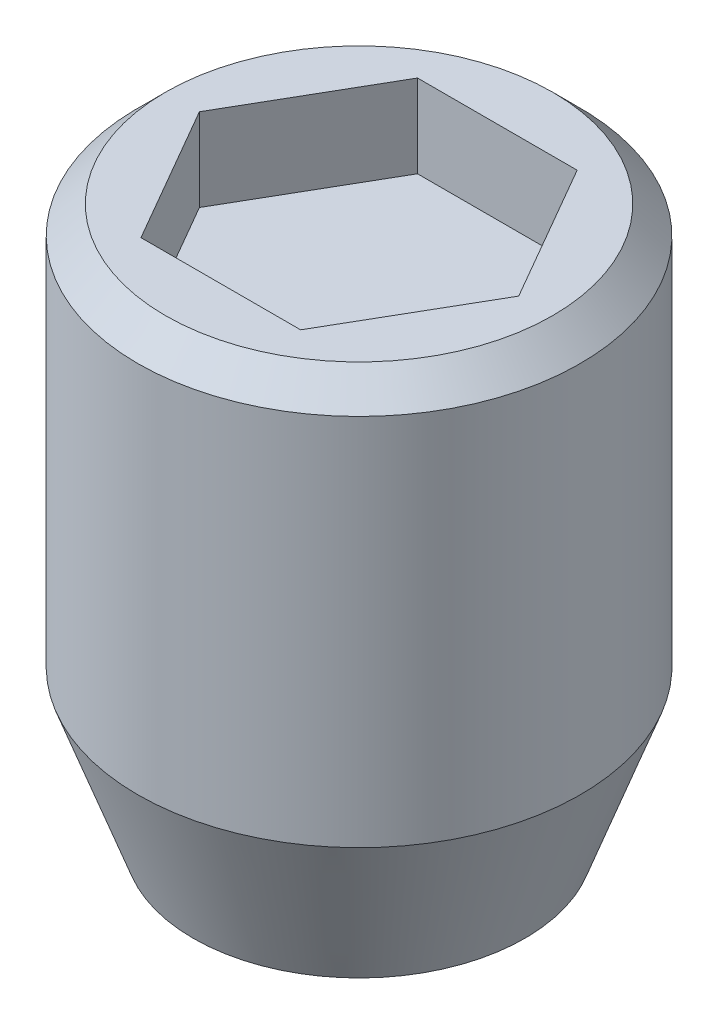
ISO-10303-21;
HEADER;
FILE_DESCRIPTION(('STEP AP214'),'2;1');
FILE_NAME('part.step','',(''),(''),'','','');
FILE_SCHEMA(('AUTOMOTIVE_DESIGN { 1 0 10303 214 1 1 1 1 }'));
ENDSEC;
DATA;
#1=APPLICATION_CONTEXT('core data for automotive mechanical design processes');
#2=APPLICATION_PROTOCOL_DEFINITION('international standard','automotive_design',2000,#1);
#3=PRODUCT_CONTEXT('',#1,'mechanical');
#4=PRODUCT('Part','Part','',(#3));
#5=PRODUCT_RELATED_PRODUCT_CATEGORY('part','',(#4));
#6=PRODUCT_DEFINITION_FORMATION('','',#4);
#7=PRODUCT_DEFINITION_CONTEXT('part definition',#1,'design');
#8=PRODUCT_DEFINITION('design','',#6,#7);
#9=PRODUCT_DEFINITION_SHAPE('','',#8);
#10=(LENGTH_UNIT() NAMED_UNIT(*) SI_UNIT(.MILLI.,.METRE.));
#11=(NAMED_UNIT(*) PLANE_ANGLE_UNIT() SI_UNIT($,.RADIAN.));
#12=(NAMED_UNIT(*) SI_UNIT($,.STERADIAN.) SOLID_ANGLE_UNIT());
#13=UNCERTAINTY_MEASURE_WITH_UNIT(LENGTH_MEASURE(1.E-05),#10,'distance_accuracy_value','');
#14=(GEOMETRIC_REPRESENTATION_CONTEXT(3) GLOBAL_UNCERTAINTY_ASSIGNED_CONTEXT((#13)) GLOBAL_UNIT_ASSIGNED_CONTEXT((#10,
#11,#12)) REPRESENTATION_CONTEXT('',''));
#15=CARTESIAN_POINT('',(0.,0.,0.));
#16=DIRECTION('',(0.,0.,1.));
#17=DIRECTION('',(1.,0.,0.));
#18=AXIS2_PLACEMENT_3D('',#15,#16,#17);
#19=CARTESIAN_POINT('',(0.,10.,0.));
#20=DIRECTION('',(0.,-1.,0.));
#21=DIRECTION('',(0.,0.,-1.));
#22=AXIS2_PLACEMENT_3D('',#19,#20,#21);
#23=CYLINDRICAL_SURFACE('',#22,4.);
#24=CARTESIAN_POINT('',(0.,2.74747741945461,0.));
#25=DIRECTION('',(0.,1.,0.));
#26=DIRECTION('',(0.,0.,1.));
#27=AXIS2_PLACEMENT_3D('',#24,#25,#26);
#28=CIRCLE('',#27,4.);
#29=CARTESIAN_POINT('',(0.,2.74747741945461,4.));
#30=VERTEX_POINT('',#29);
#31=EDGE_CURVE('E48',#30,#30,#28,.T.);
#32=ORIENTED_EDGE('',*,*,#31,.T.);
#33=EDGE_LOOP('',(#32));
#34=FACE_BOUND('',#33,.T.);
#35=CARTESIAN_POINT('',(0.,9.5,0.));
#36=DIRECTION('',(0.,1.,0.));
#37=DIRECTION('',(0.,0.,1.));
#38=AXIS2_PLACEMENT_3D('',#35,#36,#37);
#39=CIRCLE('',#38,4.);
#40=CARTESIAN_POINT('',(0.,9.5,4.));
#41=VERTEX_POINT('',#40);
#42=EDGE_CURVE('E150',#41,#41,#39,.F.);
#43=ORIENTED_EDGE('',*,*,#42,.T.);
#44=EDGE_LOOP('',(#43));
#45=FACE_BOUND('',#44,.T.);
#46=ADVANCED_FACE('F39',(#34,#45),#23,.T.);
#47=CARTESIAN_POINT('',(0.,10.,0.));
#48=DIRECTION('',(0.,1.,0.));
#49=DIRECTION('',(0.,0.,1.));
#50=AXIS2_PLACEMENT_3D('',#47,#48,#49);
#51=PLANE('',#50);
#52=CARTESIAN_POINT('',(0.,10.,0.));
#53=DIRECTION('',(0.,1.,0.));
#54=DIRECTION('',(0.,0.,1.));
#55=AXIS2_PLACEMENT_3D('',#52,#53,#54);
#56=CIRCLE('',#55,3.5);
#57=CARTESIAN_POINT('',(0.,10.,3.5));
#58=VERTEX_POINT('',#57);
#59=EDGE_CURVE('E142',#58,#58,#56,.T.);
#60=ORIENTED_EDGE('',*,*,#59,.T.);
#61=EDGE_LOOP('',(#60));
#62=FACE_BOUND('',#61,.T.);
#63=DIRECTION('',(0.5,0.,-0.866025403784439));
#64=VECTOR('',#63,1.);
#65=CARTESIAN_POINT('',(1.44337567297406,10.,2.5));
#66=LINE('',#65,#64);
#67=CARTESIAN_POINT('',(1.44337567297406,10.,2.5));
#68=VERTEX_POINT('',#67);
#69=CARTESIAN_POINT('',(2.88675134594813,10.,0.));
#70=VERTEX_POINT('',#69);
#71=EDGE_CURVE('E55',#68,#70,#66,.T.);
#72=ORIENTED_EDGE('',*,*,#71,.F.);
#73=DIRECTION('',(1.,0.,0.));
#74=VECTOR('',#73,1.);
#75=CARTESIAN_POINT('',(-1.44337567297406,10.,2.5));
#76=LINE('',#75,#74);
#77=CARTESIAN_POINT('',(-1.44337567297406,10.,2.5));
#78=VERTEX_POINT('',#77);
#79=EDGE_CURVE('E138',#78,#68,#76,.T.);
#80=ORIENTED_EDGE('',*,*,#79,.F.);
#81=DIRECTION('',(0.5,0.,0.866025403784439));
#82=VECTOR('',#81,1.);
#83=CARTESIAN_POINT('',(-2.88675134594813,10.,0.));
#84=LINE('',#83,#82);
#85=CARTESIAN_POINT('',(-2.88675134594813,10.,0.));
#86=VERTEX_POINT('',#85);
#87=EDGE_CURVE('E136',#86,#78,#84,.T.);
#88=ORIENTED_EDGE('',*,*,#87,.F.);
#89=DIRECTION('',(-0.5,0.,0.866025403784439));
#90=VECTOR('',#89,1.);
#91=CARTESIAN_POINT('',(-1.44337567297406,10.,-2.5));
#92=LINE('',#91,#90);
#93=CARTESIAN_POINT('',(-1.44337567297406,10.,-2.5));
#94=VERTEX_POINT('',#93);
#95=EDGE_CURVE('E103',#94,#86,#92,.T.);
#96=ORIENTED_EDGE('',*,*,#95,.F.);
#97=DIRECTION('',(-1.,0.,0.));
#98=VECTOR('',#97,1.);
#99=CARTESIAN_POINT('',(1.44337567297406,10.,-2.5));
#100=LINE('',#99,#98);
#101=CARTESIAN_POINT('',(1.44337567297406,10.,-2.5));
#102=VERTEX_POINT('',#101);
#103=EDGE_CURVE('E132',#102,#94,#100,.T.);
#104=ORIENTED_EDGE('',*,*,#103,.F.);
#105=DIRECTION('',(-0.5,0.,-0.866025403784439));
#106=VECTOR('',#105,1.);
#107=CARTESIAN_POINT('',(2.88675134594813,10.,0.));
#108=LINE('',#107,#106);
#109=EDGE_CURVE('E129',#70,#102,#108,.T.);
#110=ORIENTED_EDGE('',*,*,#109,.F.);
#111=EDGE_LOOP('',(#72,#80,#88,#96,#104,#110));
#112=FACE_BOUND('',#111,.T.);
#113=ADVANCED_FACE('F166',(#62,#112),#51,.T.);
#114=CARTESIAN_POINT('',(0.,0.,0.));
#115=DIRECTION('',(0.,1.,0.));
#116=DIRECTION('',(0.,0.,1.));
#117=AXIS2_PLACEMENT_3D('',#114,#115,#116);
#118=PLANE('',#117);
#119=CARTESIAN_POINT('',(0.,0.,0.));
#120=DIRECTION('',(0.,1.,0.));
#121=DIRECTION('',(0.,0.,1.));
#122=AXIS2_PLACEMENT_3D('',#119,#120,#121);
#123=CIRCLE('',#122,3.);
#124=CARTESIAN_POINT('',(0.,0.,3.));
#125=VERTEX_POINT('',#124);
#126=EDGE_CURVE('E11',#125,#125,#123,.F.);
#127=ORIENTED_EDGE('',*,*,#126,.T.);
#128=EDGE_LOOP('',(#127));
#129=FACE_BOUND('',#128,.T.);
#130=ADVANCED_FACE('F171',(#129),#118,.F.);
#131=CARTESIAN_POINT('',(1.44337567297406,8.5,2.5));
#132=DIRECTION('',(0.866025403784439,0.,0.5));
#133=DIRECTION('',(0.5,0.,-0.866025403784439));
#134=AXIS2_PLACEMENT_3D('',#131,#132,#133);
#135=PLANE('',#134);
#136=ORIENTED_EDGE('',*,*,#71,.T.);
#137=DIRECTION('',(0.,1.,0.));
#138=VECTOR('',#137,1.);
#139=CARTESIAN_POINT('',(2.88675134594813,8.5,0.));
#140=LINE('',#139,#138);
#141=CARTESIAN_POINT('',(2.88675134594813,8.5,0.));
#142=VERTEX_POINT('',#141);
#143=EDGE_CURVE('E85',#142,#70,#140,.T.);
#144=ORIENTED_EDGE('',*,*,#143,.F.);
#145=DIRECTION('',(0.5,0.,-0.866025403784439));
#146=VECTOR('',#145,1.);
#147=CARTESIAN_POINT('',(1.44337567297406,8.5,2.5));
#148=LINE('',#147,#146);
#149=CARTESIAN_POINT('',(1.44337567297406,8.5,2.5));
#150=VERTEX_POINT('',#149);
#151=EDGE_CURVE('E140',#150,#142,#148,.T.);
#152=ORIENTED_EDGE('',*,*,#151,.F.);
#153=DIRECTION('',(0.,1.,0.));
#154=VECTOR('',#153,1.);
#155=CARTESIAN_POINT('',(1.44337567297406,8.5,2.5));
#156=LINE('',#155,#154);
#157=EDGE_CURVE('E63',#150,#68,#156,.T.);
#158=ORIENTED_EDGE('',*,*,#157,.T.);
#159=EDGE_LOOP('',(#136,#144,#152,#158));
#160=FACE_BOUND('',#159,.T.);
#161=ADVANCED_FACE('F181',(#160),#135,.F.);
#162=CARTESIAN_POINT('',(-1.44337567297406,8.5,2.5));
#163=DIRECTION('',(0.,0.,1.));
#164=DIRECTION('',(1.,0.,0.));
#165=AXIS2_PLACEMENT_3D('',#162,#163,#164);
#166=PLANE('',#165);
#167=ORIENTED_EDGE('',*,*,#79,.T.);
#168=ORIENTED_EDGE('',*,*,#157,.F.);
#169=DIRECTION('',(1.,0.,0.));
#170=VECTOR('',#169,1.);
#171=CARTESIAN_POINT('',(-1.44337567297406,8.5,2.5));
#172=LINE('',#171,#170);
#173=CARTESIAN_POINT('',(-1.44337567297406,8.5,2.5));
#174=VERTEX_POINT('',#173);
#175=EDGE_CURVE('E115',#174,#150,#172,.T.);
#176=ORIENTED_EDGE('',*,*,#175,.F.);
#177=DIRECTION('',(0.,1.,0.));
#178=VECTOR('',#177,1.);
#179=CARTESIAN_POINT('',(-1.44337567297406,8.5,2.5));
#180=LINE('',#179,#178);
#181=EDGE_CURVE('E107',#174,#78,#180,.T.);
#182=ORIENTED_EDGE('',*,*,#181,.T.);
#183=EDGE_LOOP('',(#167,#168,#176,#182));
#184=FACE_BOUND('',#183,.T.);
#185=ADVANCED_FACE('F186',(#184),#166,.F.);
#186=CARTESIAN_POINT('',(-2.88675134594813,8.5,0.));
#187=DIRECTION('',(-0.866025403784439,0.,0.5));
#188=DIRECTION('',(0.5,0.,0.866025403784439));
#189=AXIS2_PLACEMENT_3D('',#186,#187,#188);
#190=PLANE('',#189);
#191=ORIENTED_EDGE('',*,*,#87,.T.);
#192=ORIENTED_EDGE('',*,*,#181,.F.);
#193=DIRECTION('',(0.5,0.,0.866025403784439));
#194=VECTOR('',#193,1.);
#195=CARTESIAN_POINT('',(-2.88675134594813,8.5,0.));
#196=LINE('',#195,#194);
#197=CARTESIAN_POINT('',(-2.88675134594813,8.5,0.));
#198=VERTEX_POINT('',#197);
#199=EDGE_CURVE('E111',#198,#174,#196,.T.);
#200=ORIENTED_EDGE('',*,*,#199,.F.);
#201=DIRECTION('',(0.,1.,0.));
#202=VECTOR('',#201,1.);
#203=CARTESIAN_POINT('',(-2.88675134594813,8.5,0.));
#204=LINE('',#203,#202);
#205=EDGE_CURVE('E96',#198,#86,#204,.T.);
#206=ORIENTED_EDGE('',*,*,#205,.T.);
#207=EDGE_LOOP('',(#191,#192,#200,#206));
#208=FACE_BOUND('',#207,.T.);
#209=ADVANCED_FACE('F112',(#208),#190,.F.);
#210=CARTESIAN_POINT('',(-1.44337567297406,8.5,-2.5));
#211=DIRECTION('',(-0.866025403784439,0.,-0.5));
#212=DIRECTION('',(-0.5,0.,0.866025403784439));
#213=AXIS2_PLACEMENT_3D('',#210,#211,#212);
#214=PLANE('',#213);
#215=ORIENTED_EDGE('',*,*,#95,.T.);
#216=ORIENTED_EDGE('',*,*,#205,.F.);
#217=DIRECTION('',(-0.5,0.,0.866025403784439));
#218=VECTOR('',#217,1.);
#219=CARTESIAN_POINT('',(-1.44337567297406,8.5,-2.5));
#220=LINE('',#219,#218);
#221=CARTESIAN_POINT('',(-1.44337567297406,8.5,-2.5));
#222=VERTEX_POINT('',#221);
#223=EDGE_CURVE('E100',#222,#198,#220,.T.);
#224=ORIENTED_EDGE('',*,*,#223,.F.);
#225=DIRECTION('',(0.,1.,0.));
#226=VECTOR('',#225,1.);
#227=CARTESIAN_POINT('',(-1.44337567297406,8.5,-2.5));
#228=LINE('',#227,#226);
#229=EDGE_CURVE('E108',#222,#94,#228,.T.);
#230=ORIENTED_EDGE('',*,*,#229,.T.);
#231=EDGE_LOOP('',(#215,#216,#224,#230));
#232=FACE_BOUND('',#231,.T.);
#233=ADVANCED_FACE('F98',(#232),#214,.F.);
#234=CARTESIAN_POINT('',(1.44337567297406,8.5,-2.5));
#235=DIRECTION('',(0.,0.,-1.));
#236=DIRECTION('',(-1.,0.,0.));
#237=AXIS2_PLACEMENT_3D('',#234,#235,#236);
#238=PLANE('',#237);
#239=ORIENTED_EDGE('',*,*,#103,.T.);
#240=ORIENTED_EDGE('',*,*,#229,.F.);
#241=DIRECTION('',(-1.,0.,0.));
#242=VECTOR('',#241,1.);
#243=CARTESIAN_POINT('',(1.44337567297406,8.5,-2.5));
#244=LINE('',#243,#242);
#245=CARTESIAN_POINT('',(1.44337567297406,8.5,-2.5));
#246=VERTEX_POINT('',#245);
#247=EDGE_CURVE('E121',#246,#222,#244,.T.);
#248=ORIENTED_EDGE('',*,*,#247,.F.);
#249=DIRECTION('',(0.,1.,0.));
#250=VECTOR('',#249,1.);
#251=CARTESIAN_POINT('',(1.44337567297406,8.5,-2.5));
#252=LINE('',#251,#250);
#253=EDGE_CURVE('E145',#246,#102,#252,.T.);
#254=ORIENTED_EDGE('',*,*,#253,.T.);
#255=EDGE_LOOP('',(#239,#240,#248,#254));
#256=FACE_BOUND('',#255,.T.);
#257=ADVANCED_FACE('F190',(#256),#238,.F.);
#258=CARTESIAN_POINT('',(2.88675134594813,8.5,0.));
#259=DIRECTION('',(0.866025403784439,0.,-0.5));
#260=DIRECTION('',(-0.5,0.,-0.866025403784439));
#261=AXIS2_PLACEMENT_3D('',#258,#259,#260);
#262=PLANE('',#261);
#263=ORIENTED_EDGE('',*,*,#109,.T.);
#264=ORIENTED_EDGE('',*,*,#253,.F.);
#265=DIRECTION('',(-0.5,0.,-0.866025403784439));
#266=VECTOR('',#265,1.);
#267=CARTESIAN_POINT('',(2.88675134594813,8.5,0.));
#268=LINE('',#267,#266);
#269=EDGE_CURVE('E123',#142,#246,#268,.T.);
#270=ORIENTED_EDGE('',*,*,#269,.F.);
#271=ORIENTED_EDGE('',*,*,#143,.T.);
#272=EDGE_LOOP('',(#263,#264,#270,#271));
#273=FACE_BOUND('',#272,.T.);
#274=ADVANCED_FACE('F187',(#273),#262,.F.);
#275=CARTESIAN_POINT('',(0.,8.5,0.));
#276=DIRECTION('',(0.,1.,0.));
#277=DIRECTION('',(0.,0.,1.));
#278=AXIS2_PLACEMENT_3D('',#275,#276,#277);
#279=PLANE('',#278);
#280=ORIENTED_EDGE('',*,*,#151,.T.);
#281=ORIENTED_EDGE('',*,*,#269,.T.);
#282=ORIENTED_EDGE('',*,*,#247,.T.);
#283=ORIENTED_EDGE('',*,*,#223,.T.);
#284=ORIENTED_EDGE('',*,*,#199,.T.);
#285=ORIENTED_EDGE('',*,*,#175,.T.);
#286=EDGE_LOOP('',(#280,#281,#282,#283,#284,#285));
#287=FACE_BOUND('',#286,.T.);
#288=ADVANCED_FACE('F118',(#287),#279,.T.);
#289=CARTESIAN_POINT('',(0.,10.,0.));
#290=DIRECTION('',(0.,-1.,0.));
#291=DIRECTION('',(0.,0.,-1.));
#292=AXIS2_PLACEMENT_3D('',#289,#290,#291);
#293=CONICAL_SURFACE('',#292,3.5,0.785398163397447);
#294=ORIENTED_EDGE('',*,*,#42,.F.);
#295=EDGE_LOOP('',(#294));
#296=FACE_BOUND('',#295,.T.);
#297=ORIENTED_EDGE('',*,*,#59,.F.);
#298=EDGE_LOOP('',(#297));
#299=FACE_BOUND('',#298,.T.);
#300=ADVANCED_FACE('F158',(#296,#299),#293,.T.);
#301=CARTESIAN_POINT('',(0.,2.74747741945461,0.));
#302=DIRECTION('',(0.,1.,0.));
#303=DIRECTION('',(0.,0.,1.));
#304=AXIS2_PLACEMENT_3D('',#301,#302,#303);
#305=CONICAL_SURFACE('',#304,4.,0.349065850398866);
#306=ORIENTED_EDGE('',*,*,#126,.F.);
#307=EDGE_LOOP('',(#306));
#308=FACE_BOUND('',#307,.T.);
#309=ORIENTED_EDGE('',*,*,#31,.F.);
#310=EDGE_LOOP('',(#309));
#311=FACE_BOUND('',#310,.T.);
#312=ADVANCED_FACE('F42',(#308,#311),#305,.T.);
#313=CLOSED_SHELL('',(#46,#113,#130,#161,#185,#209,#233,#257,#274,#288,#300,#312));
#314=MANIFOLD_SOLID_BREP('B2',#313);
#315=ADVANCED_BREP_SHAPE_REPRESENTATION('',(#18,#314),#14);
#316=SHAPE_DEFINITION_REPRESENTATION(#9,#315);
ENDSEC;
END-ISO-10303-21;
